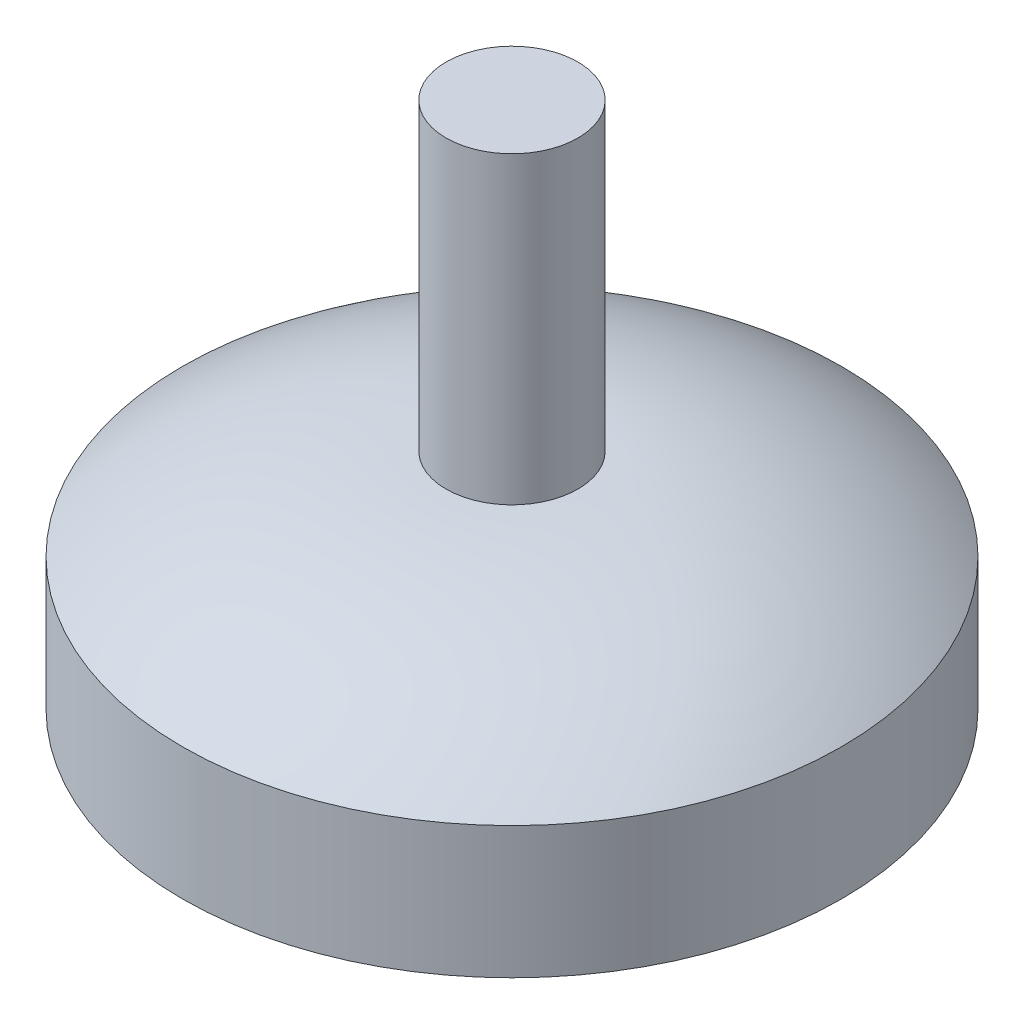
ISO-10303-21;
HEADER;
FILE_DESCRIPTION(('STEP AP214'),'2;1');
FILE_NAME('part.step','',(''),(''),'','','');
FILE_SCHEMA(('AUTOMOTIVE_DESIGN { 1 0 10303 214 1 1 1 1 }'));
ENDSEC;
DATA;
#1=APPLICATION_CONTEXT('core data for automotive mechanical design processes');
#2=APPLICATION_PROTOCOL_DEFINITION('international standard','automotive_design',2000,#1);
#3=PRODUCT_CONTEXT('',#1,'mechanical');
#4=PRODUCT('Part','Part','',(#3));
#5=PRODUCT_RELATED_PRODUCT_CATEGORY('part','',(#4));
#6=PRODUCT_DEFINITION_FORMATION('','',#4);
#7=PRODUCT_DEFINITION_CONTEXT('part definition',#1,'design');
#8=PRODUCT_DEFINITION('design','',#6,#7);
#9=PRODUCT_DEFINITION_SHAPE('','',#8);
#10=(LENGTH_UNIT() NAMED_UNIT(*) SI_UNIT(.MILLI.,.METRE.));
#11=(NAMED_UNIT(*) PLANE_ANGLE_UNIT() SI_UNIT($,.RADIAN.));
#12=(NAMED_UNIT(*) SI_UNIT($,.STERADIAN.) SOLID_ANGLE_UNIT());
#13=UNCERTAINTY_MEASURE_WITH_UNIT(LENGTH_MEASURE(1.E-05),#10,'distance_accuracy_value','');
#14=(GEOMETRIC_REPRESENTATION_CONTEXT(3) GLOBAL_UNCERTAINTY_ASSIGNED_CONTEXT((#13)) GLOBAL_UNIT_ASSIGNED_CONTEXT((#10,
#11,#12)) REPRESENTATION_CONTEXT('',''));
#15=CARTESIAN_POINT('',(0.,0.,0.));
#16=DIRECTION('',(0.,0.,1.));
#17=DIRECTION('',(1.,0.,0.));
#18=AXIS2_PLACEMENT_3D('',#15,#16,#17);
#19=CARTESIAN_POINT('',(0.,10.,0.));
#20=DIRECTION('',(0.,-1.,0.));
#21=DIRECTION('',(0.,0.,-1.));
#22=AXIS2_PLACEMENT_3D('',#19,#20,#21);
#23=CYLINDRICAL_SURFACE('',#22,25.);
#24=CARTESIAN_POINT('',(0.,10.,0.));
#25=DIRECTION('',(0.,1.,0.));
#26=DIRECTION('',(0.,0.,1.));
#27=AXIS2_PLACEMENT_3D('',#24,#25,#26);
#28=CIRCLE('',#27,25.);
#29=CARTESIAN_POINT('',(0.,10.,25.));
#30=VERTEX_POINT('',#29);
#31=EDGE_CURVE('E36',#30,#30,#28,.T.);
#32=ORIENTED_EDGE('',*,*,#31,.F.);
#33=EDGE_LOOP('',(#32));
#34=FACE_BOUND('',#33,.T.);
#35=CARTESIAN_POINT('',(0.,0.,0.));
#36=DIRECTION('',(0.,1.,0.));
#37=DIRECTION('',(0.,0.,1.));
#38=AXIS2_PLACEMENT_3D('',#35,#36,#37);
#39=CIRCLE('',#38,25.);
#40=CARTESIAN_POINT('',(0.,0.,25.));
#41=VERTEX_POINT('',#40);
#42=EDGE_CURVE('E40',#41,#41,#39,.T.);
#43=ORIENTED_EDGE('',*,*,#42,.T.);
#44=EDGE_LOOP('',(#43));
#45=FACE_BOUND('',#44,.T.);
#46=ADVANCED_FACE('F30',(#34,#45),#23,.T.);
#47=CARTESIAN_POINT('',(0.,0.,0.));
#48=DIRECTION('',(0.,1.,0.));
#49=DIRECTION('',(0.,0.,1.));
#50=AXIS2_PLACEMENT_3D('',#47,#48,#49);
#51=PLANE('',#50);
#52=ORIENTED_EDGE('',*,*,#42,.F.);
#53=EDGE_LOOP('',(#52));
#54=FACE_BOUND('',#53,.T.);
#55=ADVANCED_FACE('F60',(#54),#51,.F.);
#56=CARTESIAN_POINT('',(25.,10.,0.));
#57=CARTESIAN_POINT('',(16.2336892394921,16.9316535323821,0.));
#58=CARTESIAN_POINT('',(5.,16.9316535323821,0.));
#59=B_SPLINE_CURVE_WITH_KNOTS('',2,(#56,#57,#58),.UNSPECIFIED.,.F.,.F.,(3,3),(0.,1.),.UNSPECIFIED.);
#60=CARTESIAN_POINT('',(0.,40.,0.));
#61=DIRECTION('',(0.,1.,0.));
#62=AXIS1_PLACEMENT('',#60,#61);
#63=SURFACE_OF_REVOLUTION('',#59,#62);
#64=CARTESIAN_POINT('',(0.,16.9316535323821,0.));
#65=DIRECTION('',(0.,1.,0.));
#66=DIRECTION('',(0.,0.,1.));
#67=AXIS2_PLACEMENT_3D('',#64,#65,#66);
#68=CIRCLE('',#67,5.);
#69=CARTESIAN_POINT('',(0.,16.9316535323821,5.));
#70=VERTEX_POINT('',#69);
#71=EDGE_CURVE('E10',#70,#70,#68,.F.);
#72=ORIENTED_EDGE('',*,*,#71,.T.);
#73=EDGE_LOOP('',(#72));
#74=FACE_BOUND('',#73,.T.);
#75=ORIENTED_EDGE('',*,*,#31,.T.);
#76=EDGE_LOOP('',(#75));
#77=FACE_BOUND('',#76,.T.);
#78=ADVANCED_FACE('F56',(#74,#77),#63,.T.);
#79=CARTESIAN_POINT('',(0.,40.,0.));
#80=DIRECTION('',(0.,1.,0.));
#81=DIRECTION('',(0.,0.,1.));
#82=AXIS2_PLACEMENT_3D('',#79,#80,#81);
#83=PLANE('',#82);
#84=CARTESIAN_POINT('',(0.,40.,0.));
#85=DIRECTION('',(0.,1.,0.));
#86=DIRECTION('',(0.,0.,1.));
#87=AXIS2_PLACEMENT_3D('',#84,#85,#86);
#88=CIRCLE('',#87,5.);
#89=CARTESIAN_POINT('',(0.,40.,5.));
#90=VERTEX_POINT('',#89);
#91=EDGE_CURVE('E45',#90,#90,#88,.T.);
#92=ORIENTED_EDGE('',*,*,#91,.T.);
#93=EDGE_LOOP('',(#92));
#94=FACE_BOUND('',#93,.T.);
#95=ADVANCED_FACE('F59',(#94),#83,.T.);
#96=CARTESIAN_POINT('',(0.,40.,0.));
#97=DIRECTION('',(0.,-1.,0.));
#98=DIRECTION('',(0.,0.,-1.));
#99=AXIS2_PLACEMENT_3D('',#96,#97,#98);
#100=CYLINDRICAL_SURFACE('',#99,5.);
#101=ORIENTED_EDGE('',*,*,#91,.F.);
#102=EDGE_LOOP('',(#101));
#103=FACE_BOUND('',#102,.T.);
#104=ORIENTED_EDGE('',*,*,#71,.F.);
#105=EDGE_LOOP('',(#104));
#106=FACE_BOUND('',#105,.T.);
#107=ADVANCED_FACE('F63',(#103,#106),#100,.T.);
#108=CLOSED_SHELL('',(#46,#55,#78,#95,#107));
#109=MANIFOLD_SOLID_BREP('B2',#108);
#110=ADVANCED_BREP_SHAPE_REPRESENTATION('',(#18,#109),#14);
#111=SHAPE_DEFINITION_REPRESENTATION(#9,#110);
ENDSEC;
END-ISO-10303-21;
